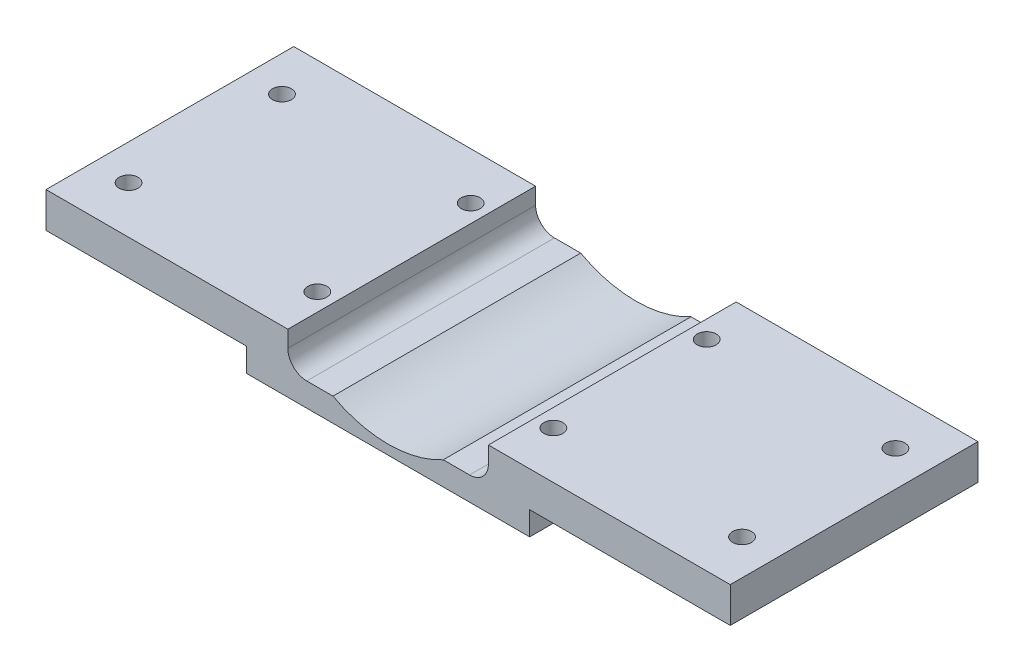
ISO-10303-21;
HEADER;
FILE_DESCRIPTION(('STEP AP214'),'2;1');
FILE_NAME('part.step','',(''),(''),'','','');
FILE_SCHEMA(('AUTOMOTIVE_DESIGN { 1 0 10303 214 1 1 1 1 }'));
ENDSEC;
DATA;
#1=APPLICATION_CONTEXT('core data for automotive mechanical design processes');
#2=APPLICATION_PROTOCOL_DEFINITION('international standard','automotive_design',2000,#1);
#3=PRODUCT_CONTEXT('',#1,'mechanical');
#4=PRODUCT('Part','Part','',(#3));
#5=PRODUCT_RELATED_PRODUCT_CATEGORY('part','',(#4));
#6=PRODUCT_DEFINITION_FORMATION('','',#4);
#7=PRODUCT_DEFINITION_CONTEXT('part definition',#1,'design');
#8=PRODUCT_DEFINITION('design','',#6,#7);
#9=PRODUCT_DEFINITION_SHAPE('','',#8);
#10=(LENGTH_UNIT() NAMED_UNIT(*) SI_UNIT(.MILLI.,.METRE.));
#11=(NAMED_UNIT(*) PLANE_ANGLE_UNIT() SI_UNIT($,.RADIAN.));
#12=(NAMED_UNIT(*) SI_UNIT($,.STERADIAN.) SOLID_ANGLE_UNIT());
#13=UNCERTAINTY_MEASURE_WITH_UNIT(LENGTH_MEASURE(1.E-05),#10,'distance_accuracy_value','');
#14=(GEOMETRIC_REPRESENTATION_CONTEXT(3) GLOBAL_UNCERTAINTY_ASSIGNED_CONTEXT((#13)) GLOBAL_UNIT_ASSIGNED_CONTEXT((#10,
#11,#12)) REPRESENTATION_CONTEXT('',''));
#15=CARTESIAN_POINT('',(0.,0.,0.));
#16=DIRECTION('',(0.,0.,1.));
#17=DIRECTION('',(1.,0.,0.));
#18=AXIS2_PLACEMENT_3D('',#15,#16,#17);
#19=CARTESIAN_POINT('',(0.,0.,0.));
#20=DIRECTION('',(0.,-1.,0.));
#21=DIRECTION('',(0.,0.,-1.));
#22=AXIS2_PLACEMENT_3D('',#19,#20,#21);
#23=PLANE('',#22);
#24=DIRECTION('',(-1.,0.,0.));
#25=VECTOR('',#24,1.);
#26=CARTESIAN_POINT('',(119.0625,0.,-66.675));
#27=LINE('',#26,#25);
#28=CARTESIAN_POINT('',(77.2354147488908,0.,-66.675));
#29=VERTEX_POINT('',#28);
#30=CARTESIAN_POINT('',(70.1675,0.,-66.675));
#31=VERTEX_POINT('',#30);
#32=EDGE_CURVE('E156',#29,#31,#27,.T.);
#33=ORIENTED_EDGE('',*,*,#32,.T.);
#34=DIRECTION('',(0.,0.,1.));
#35=VECTOR('',#34,1.);
#36=CARTESIAN_POINT('',(70.1675,0.,0.));
#37=LINE('',#36,#35);
#38=CARTESIAN_POINT('',(70.1675,0.,0.));
#39=VERTEX_POINT('',#38);
#40=EDGE_CURVE('E301',#31,#39,#37,.T.);
#41=ORIENTED_EDGE('',*,*,#40,.T.);
#42=DIRECTION('',(1.,0.,0.));
#43=VECTOR('',#42,1.);
#44=CARTESIAN_POINT('',(119.0625,0.,0.));
#45=LINE('',#44,#43);
#46=CARTESIAN_POINT('',(77.2354147488908,0.,0.));
#47=VERTEX_POINT('',#46);
#48=EDGE_CURVE('E223',#39,#47,#45,.T.);
#49=ORIENTED_EDGE('',*,*,#48,.T.);
#50=DIRECTION('',(0.,0.,-1.));
#51=VECTOR('',#50,1.);
#52=CARTESIAN_POINT('',(77.2354147488908,0.,0.));
#53=LINE('',#52,#51);
#54=EDGE_CURVE('E165',#47,#29,#53,.T.);
#55=ORIENTED_EDGE('',*,*,#54,.T.);
#56=EDGE_LOOP('',(#33,#41,#49,#55));
#57=FACE_BOUND('',#56,.T.);
#58=ADVANCED_FACE('F35',(#57),#23,.F.);
#59=CARTESIAN_POINT('',(0.,9.525,0.));
#60=DIRECTION('',(0.,-1.,0.));
#61=DIRECTION('',(0.,0.,-1.));
#62=AXIS2_PLACEMENT_3D('',#59,#60,#61);
#63=PLANE('',#62);
#64=CARTESIAN_POINT('',(60.325,9.525,-12.7));
#65=DIRECTION('',(0.,1.,0.));
#66=DIRECTION('',(0.,0.,1.));
#67=AXIS2_PLACEMENT_3D('',#64,#65,#66);
#68=CIRCLE('',#67,2.5527);
#69=CARTESIAN_POINT('',(60.325,9.525,-10.1473));
#70=VERTEX_POINT('',#69);
#71=EDGE_CURVE('E186',#70,#70,#68,.T.);
#72=ORIENTED_EDGE('',*,*,#71,.F.);
#73=EDGE_LOOP('',(#72));
#74=FACE_BOUND('',#73,.T.);
#75=CARTESIAN_POINT('',(60.325,9.525,-53.975));
#76=DIRECTION('',(0.,1.,0.));
#77=DIRECTION('',(0.,0.,1.));
#78=AXIS2_PLACEMENT_3D('',#75,#76,#77);
#79=CIRCLE('',#78,2.55270000000001);
#80=CARTESIAN_POINT('',(60.325,9.525,-51.4223));
#81=VERTEX_POINT('',#80);
#82=EDGE_CURVE('E192',#81,#81,#79,.T.);
#83=ORIENTED_EDGE('',*,*,#82,.F.);
#84=EDGE_LOOP('',(#83));
#85=FACE_BOUND('',#84,.T.);
#86=DIRECTION('',(1.,0.,0.));
#87=VECTOR('',#86,1.);
#88=CARTESIAN_POINT('',(0.,9.525,0.));
#89=LINE('',#88,#87);
#90=CARTESIAN_POINT('',(0.,9.525,0.));
#91=VERTEX_POINT('',#90);
#92=CARTESIAN_POINT('',(65.0875,9.525,0.));
#93=VERTEX_POINT('',#92);
#94=EDGE_CURVE('E269',#91,#93,#89,.T.);
#95=ORIENTED_EDGE('',*,*,#94,.T.);
#96=DIRECTION('',(0.,0.,1.));
#97=VECTOR('',#96,1.);
#98=CARTESIAN_POINT('',(65.0875,9.525,-66.675));
#99=LINE('',#98,#97);
#100=CARTESIAN_POINT('',(65.0875,9.525,-66.675));
#101=VERTEX_POINT('',#100);
#102=EDGE_CURVE('E228',#101,#93,#99,.T.);
#103=ORIENTED_EDGE('',*,*,#102,.F.);
#104=DIRECTION('',(-1.,0.,0.));
#105=VECTOR('',#104,1.);
#106=CARTESIAN_POINT('',(0.,9.525,-66.675));
#107=LINE('',#106,#105);
#108=CARTESIAN_POINT('',(0.,9.525,-66.675));
#109=VERTEX_POINT('',#108);
#110=EDGE_CURVE('E274',#101,#109,#107,.T.);
#111=ORIENTED_EDGE('',*,*,#110,.T.);
#112=DIRECTION('',(0.,0.,1.));
#113=VECTOR('',#112,1.);
#114=CARTESIAN_POINT('',(0.,9.525,0.));
#115=LINE('',#114,#113);
#116=EDGE_CURVE('E264',#109,#91,#115,.T.);
#117=ORIENTED_EDGE('',*,*,#116,.T.);
#118=EDGE_LOOP('',(#95,#103,#111,#117));
#119=FACE_BOUND('',#118,.T.);
#120=CARTESIAN_POINT('',(9.525,9.525,-12.7));
#121=DIRECTION('',(0.,1.,0.));
#122=DIRECTION('',(0.,0.,1.));
#123=AXIS2_PLACEMENT_3D('',#120,#121,#122);
#124=CIRCLE('',#123,2.5527);
#125=CARTESIAN_POINT('',(9.525,9.525,-10.1473));
#126=VERTEX_POINT('',#125);
#127=EDGE_CURVE('E180',#126,#126,#124,.T.);
#128=ORIENTED_EDGE('',*,*,#127,.F.);
#129=EDGE_LOOP('',(#128));
#130=FACE_BOUND('',#129,.T.);
#131=CARTESIAN_POINT('',(9.52500000000001,9.525,-53.975));
#132=DIRECTION('',(0.,1.,0.));
#133=DIRECTION('',(0.,0.,1.));
#134=AXIS2_PLACEMENT_3D('',#131,#132,#133);
#135=CIRCLE('',#134,2.5527);
#136=CARTESIAN_POINT('',(9.52500000000001,9.525,-51.4223));
#137=VERTEX_POINT('',#136);
#138=EDGE_CURVE('E172',#137,#137,#135,.T.);
#139=ORIENTED_EDGE('',*,*,#138,.F.);
#140=EDGE_LOOP('',(#139));
#141=FACE_BOUND('',#140,.T.);
#142=ADVANCED_FACE('F327',(#74,#85,#119,#130,#141),#63,.F.);
#143=CARTESIAN_POINT('',(123.825,9.525,-53.975));
#144=DIRECTION('',(0.,1.,0.));
#145=DIRECTION('',(0.,0.,1.));
#146=AXIS2_PLACEMENT_3D('',#143,#144,#145);
#147=CIRCLE('',#146,2.55270000000001);
#148=CARTESIAN_POINT('',(123.825,9.525,-51.4223));
#149=VERTEX_POINT('',#148);
#150=EDGE_CURVE('E198',#149,#149,#147,.T.);
#151=ORIENTED_EDGE('',*,*,#150,.F.);
#152=EDGE_LOOP('',(#151));
#153=FACE_BOUND('',#152,.T.);
#154=CARTESIAN_POINT('',(123.849810746291,9.525,-12.7));
#155=DIRECTION('',(0.,1.,0.));
#156=DIRECTION('',(0.,0.,1.));
#157=AXIS2_PLACEMENT_3D('',#154,#155,#156);
#158=CIRCLE('',#157,2.55270000000001);
#159=CARTESIAN_POINT('',(123.849810746291,9.525,-10.1473));
#160=VERTEX_POINT('',#159);
#161=EDGE_CURVE('E204',#160,#160,#158,.T.);
#162=ORIENTED_EDGE('',*,*,#161,.F.);
#163=EDGE_LOOP('',(#162));
#164=FACE_BOUND('',#163,.T.);
#165=CARTESIAN_POINT('',(174.625,9.525,-12.7));
#166=DIRECTION('',(0.,1.,0.));
#167=DIRECTION('',(0.,0.,1.));
#168=AXIS2_PLACEMENT_3D('',#165,#166,#167);
#169=CIRCLE('',#168,2.55269999999999);
#170=CARTESIAN_POINT('',(174.625,9.525,-10.1473));
#171=VERTEX_POINT('',#170);
#172=EDGE_CURVE('E210',#171,#171,#169,.T.);
#173=ORIENTED_EDGE('',*,*,#172,.F.);
#174=EDGE_LOOP('',(#173));
#175=FACE_BOUND('',#174,.T.);
#176=CARTESIAN_POINT('',(174.625,9.525,-53.975));
#177=DIRECTION('',(0.,1.,0.));
#178=DIRECTION('',(0.,0.,1.));
#179=AXIS2_PLACEMENT_3D('',#176,#177,#178);
#180=CIRCLE('',#179,2.55269999999999);
#181=CARTESIAN_POINT('',(174.625,9.525,-51.4223));
#182=VERTEX_POINT('',#181);
#183=EDGE_CURVE('E216',#182,#182,#180,.T.);
#184=ORIENTED_EDGE('',*,*,#183,.F.);
#185=EDGE_LOOP('',(#184));
#186=FACE_BOUND('',#185,.T.);
#187=CARTESIAN_POINT('',(184.15,9.525,-66.675));
#188=VERTEX_POINT('',#187);
#189=CARTESIAN_POINT('',(119.0625,9.525,-66.675));
#190=VERTEX_POINT('',#189);
#191=EDGE_CURVE('E275',#188,#190,#107,.T.);
#192=ORIENTED_EDGE('',*,*,#191,.T.);
#193=DIRECTION('',(0.,0.,-1.));
#194=VECTOR('',#193,1.);
#195=CARTESIAN_POINT('',(119.0625,9.525,-66.675));
#196=LINE('',#195,#194);
#197=CARTESIAN_POINT('',(119.0625,9.525,0.));
#198=VERTEX_POINT('',#197);
#199=EDGE_CURVE('E221',#198,#190,#196,.T.);
#200=ORIENTED_EDGE('',*,*,#199,.F.);
#201=CARTESIAN_POINT('',(184.15,9.525,0.));
#202=VERTEX_POINT('',#201);
#203=EDGE_CURVE('E267',#198,#202,#89,.T.);
#204=ORIENTED_EDGE('',*,*,#203,.T.);
#205=DIRECTION('',(0.,0.,-1.));
#206=VECTOR('',#205,1.);
#207=CARTESIAN_POINT('',(184.15,9.525,0.));
#208=LINE('',#207,#206);
#209=EDGE_CURVE('E272',#202,#188,#208,.T.);
#210=ORIENTED_EDGE('',*,*,#209,.T.);
#211=EDGE_LOOP('',(#192,#200,#204,#210));
#212=FACE_BOUND('',#211,.T.);
#213=ADVANCED_FACE('F366',(#153,#164,#175,#186,#212),#63,.F.);
#214=CARTESIAN_POINT('',(0.,0.,0.));
#215=DIRECTION('',(0.,-1.,0.));
#216=DIRECTION('',(0.,0.,-1.));
#217=AXIS2_PLACEMENT_3D('',#214,#215,#216);
#218=PLANE('',#217);
#219=CARTESIAN_POINT('',(9.52500000000001,0.,-53.975));
#220=DIRECTION('',(0.,-1.,0.));
#221=DIRECTION('',(0.,0.,-1.));
#222=AXIS2_PLACEMENT_3D('',#219,#220,#221);
#223=CIRCLE('',#222,2.5527);
#224=CARTESIAN_POINT('',(9.52500000000001,0.,-56.5277));
#225=VERTEX_POINT('',#224);
#226=EDGE_CURVE('E177',#225,#225,#223,.T.);
#227=ORIENTED_EDGE('',*,*,#226,.F.);
#228=EDGE_LOOP('',(#227));
#229=FACE_BOUND('',#228,.T.);
#230=CARTESIAN_POINT('',(9.525,0.,-12.7));
#231=DIRECTION('',(0.,-1.,0.));
#232=DIRECTION('',(0.,0.,-1.));
#233=AXIS2_PLACEMENT_3D('',#230,#231,#232);
#234=CIRCLE('',#233,2.5527);
#235=CARTESIAN_POINT('',(9.525,0.,-15.2527));
#236=VERTEX_POINT('',#235);
#237=EDGE_CURVE('E183',#236,#236,#234,.T.);
#238=ORIENTED_EDGE('',*,*,#237,.F.);
#239=EDGE_LOOP('',(#238));
#240=FACE_BOUND('',#239,.T.);
#241=DIRECTION('',(-1.,0.,0.));
#242=VECTOR('',#241,1.);
#243=CARTESIAN_POINT('',(0.,0.,-66.675));
#244=LINE('',#243,#242);
#245=CARTESIAN_POINT('',(53.975,0.,-66.675));
#246=VERTEX_POINT('',#245);
#247=CARTESIAN_POINT('',(0.,0.,-66.675));
#248=VERTEX_POINT('',#247);
#249=EDGE_CURVE('E287',#246,#248,#244,.T.);
#250=ORIENTED_EDGE('',*,*,#249,.F.);
#251=DIRECTION('',(0.,0.,1.));
#252=VECTOR('',#251,1.);
#253=CARTESIAN_POINT('',(53.975,0.,-143.139125575331));
#254=LINE('',#253,#252);
#255=CARTESIAN_POINT('',(53.975,0.,0.));
#256=VERTEX_POINT('',#255);
#257=EDGE_CURVE('E242',#246,#256,#254,.T.);
#258=ORIENTED_EDGE('',*,*,#257,.T.);
#259=DIRECTION('',(1.,0.,0.));
#260=VECTOR('',#259,1.);
#261=CARTESIAN_POINT('',(0.,0.,0.));
#262=LINE('',#261,#260);
#263=CARTESIAN_POINT('',(0.,0.,0.));
#264=VERTEX_POINT('',#263);
#265=EDGE_CURVE('E282',#264,#256,#262,.T.);
#266=ORIENTED_EDGE('',*,*,#265,.F.);
#267=DIRECTION('',(0.,0.,1.));
#268=VECTOR('',#267,1.);
#269=CARTESIAN_POINT('',(0.,0.,0.));
#270=LINE('',#269,#268);
#271=EDGE_CURVE('E263',#248,#264,#270,.T.);
#272=ORIENTED_EDGE('',*,*,#271,.F.);
#273=EDGE_LOOP('',(#250,#258,#266,#272));
#274=FACE_BOUND('',#273,.T.);
#275=ADVANCED_FACE('F337',(#229,#240,#274),#218,.T.);
#276=CARTESIAN_POINT('',(0.,9.525,0.));
#277=DIRECTION('',(1.,0.,0.));
#278=DIRECTION('',(0.,0.,-1.));
#279=AXIS2_PLACEMENT_3D('',#276,#277,#278);
#280=PLANE('',#279);
#281=ORIENTED_EDGE('',*,*,#271,.T.);
#282=DIRECTION('',(0.,-1.,0.));
#283=VECTOR('',#282,1.);
#284=CARTESIAN_POINT('',(0.,9.525,0.));
#285=LINE('',#284,#283);
#286=EDGE_CURVE('E166',#91,#264,#285,.T.);
#287=ORIENTED_EDGE('',*,*,#286,.F.);
#288=ORIENTED_EDGE('',*,*,#116,.F.);
#289=DIRECTION('',(0.,-1.,0.));
#290=VECTOR('',#289,1.);
#291=CARTESIAN_POINT('',(0.,9.525,-66.675));
#292=LINE('',#291,#290);
#293=EDGE_CURVE('E278',#109,#248,#292,.T.);
#294=ORIENTED_EDGE('',*,*,#293,.T.);
#295=EDGE_LOOP('',(#281,#287,#288,#294));
#296=FACE_BOUND('',#295,.T.);
#297=ADVANCED_FACE('F334',(#296),#280,.F.);
#298=CARTESIAN_POINT('',(0.,9.525,0.));
#299=DIRECTION('',(0.,0.,-1.));
#300=DIRECTION('',(-1.,0.,0.));
#301=AXIS2_PLACEMENT_3D('',#298,#299,#300);
#302=PLANE('',#301);
#303=CARTESIAN_POINT('',(106.914585251109,0.,0.));
#304=VERTEX_POINT('',#303);
#305=CARTESIAN_POINT('',(113.9825,0.,0.));
#306=VERTEX_POINT('',#305);
#307=EDGE_CURVE('E155',#304,#306,#45,.T.);
#308=ORIENTED_EDGE('',*,*,#307,.F.);
#309=CARTESIAN_POINT('',(92.0749999999998,27.2393713169503,0.));
#310=DIRECTION('',(0.,0.,-1.));
#311=DIRECTION('',(-1.,0.,0.));
#312=AXIS2_PLACEMENT_3D('',#309,#310,#311);
#313=CIRCLE('',#312,31.0192946432962);
#314=EDGE_CURVE('E164',#304,#47,#313,.T.);
#315=ORIENTED_EDGE('',*,*,#314,.T.);
#316=ORIENTED_EDGE('',*,*,#48,.F.);
#317=CARTESIAN_POINT('',(70.1675,5.08,0.));
#318=DIRECTION('',(0.,0.,-1.));
#319=DIRECTION('',(-1.,0.,0.));
#320=AXIS2_PLACEMENT_3D('',#317,#318,#319);
#321=CIRCLE('',#320,5.08);
#322=CARTESIAN_POINT('',(65.0875,5.08,0.));
#323=VERTEX_POINT('',#322);
#324=EDGE_CURVE('E306',#39,#323,#321,.T.);
#325=ORIENTED_EDGE('',*,*,#324,.T.);
#326=DIRECTION('',(0.,1.,0.));
#327=VECTOR('',#326,1.);
#328=CARTESIAN_POINT('',(65.0875,0.,0.));
#329=LINE('',#328,#327);
#330=EDGE_CURVE('E234',#323,#93,#329,.T.);
#331=ORIENTED_EDGE('',*,*,#330,.T.);
#332=ORIENTED_EDGE('',*,*,#94,.F.);
#333=ORIENTED_EDGE('',*,*,#286,.T.);
#334=ORIENTED_EDGE('',*,*,#265,.T.);
#335=DIRECTION('',(0.,-1.,0.));
#336=VECTOR('',#335,1.);
#337=CARTESIAN_POINT('',(53.975,0.,0.));
#338=LINE('',#337,#336);
#339=CARTESIAN_POINT('',(53.975,-6.35,0.));
#340=VERTEX_POINT('',#339);
#341=EDGE_CURVE('E233',#256,#340,#338,.T.);
#342=ORIENTED_EDGE('',*,*,#341,.T.);
#343=DIRECTION('',(1.,0.,0.));
#344=VECTOR('',#343,1.);
#345=CARTESIAN_POINT('',(53.975,-6.35,0.));
#346=LINE('',#345,#344);
#347=CARTESIAN_POINT('',(130.175,-6.34999999999999,0.));
#348=VERTEX_POINT('',#347);
#349=EDGE_CURVE('E248',#340,#348,#346,.T.);
#350=ORIENTED_EDGE('',*,*,#349,.T.);
#351=DIRECTION('',(0.,1.,0.));
#352=VECTOR('',#351,1.);
#353=CARTESIAN_POINT('',(130.175,0.,0.));
#354=LINE('',#353,#352);
#355=CARTESIAN_POINT('',(130.175,0.,0.));
#356=VERTEX_POINT('',#355);
#357=EDGE_CURVE('E251',#348,#356,#354,.T.);
#358=ORIENTED_EDGE('',*,*,#357,.T.);
#359=CARTESIAN_POINT('',(184.15,0.,0.));
#360=VERTEX_POINT('',#359);
#361=EDGE_CURVE('E281',#356,#360,#262,.T.);
#362=ORIENTED_EDGE('',*,*,#361,.T.);
#363=DIRECTION('',(0.,-1.,0.));
#364=VECTOR('',#363,1.);
#365=CARTESIAN_POINT('',(184.15,9.525,0.));
#366=LINE('',#365,#364);
#367=EDGE_CURVE('E295',#202,#360,#366,.T.);
#368=ORIENTED_EDGE('',*,*,#367,.F.);
#369=ORIENTED_EDGE('',*,*,#203,.F.);
#370=DIRECTION('',(0.,1.,0.));
#371=VECTOR('',#370,1.);
#372=CARTESIAN_POINT('',(119.0625,0.,0.));
#373=LINE('',#372,#371);
#374=CARTESIAN_POINT('',(119.0625,5.08,0.));
#375=VERTEX_POINT('',#374);
#376=EDGE_CURVE('E231',#375,#198,#373,.T.);
#377=ORIENTED_EDGE('',*,*,#376,.F.);
#378=CARTESIAN_POINT('',(113.9825,5.08,0.));
#379=DIRECTION('',(0.,0.,-1.));
#380=DIRECTION('',(-1.,0.,0.));
#381=AXIS2_PLACEMENT_3D('',#378,#379,#380);
#382=CIRCLE('',#381,5.08);
#383=EDGE_CURVE('E11',#375,#306,#382,.T.);
#384=ORIENTED_EDGE('',*,*,#383,.T.);
#385=EDGE_LOOP('',(#308,#315,#316,#325,#331,#332,#333,#334,#342,#350,#358,#362,#368,#369,#377,#384));
#386=FACE_BOUND('',#385,.T.);
#387=ADVANCED_FACE('F322',(#386),#302,.F.);
#388=CARTESIAN_POINT('',(184.15,9.525,0.));
#389=DIRECTION('',(-1.,0.,0.));
#390=DIRECTION('',(0.,0.,1.));
#391=AXIS2_PLACEMENT_3D('',#388,#389,#390);
#392=PLANE('',#391);
#393=DIRECTION('',(0.,0.,-1.));
#394=VECTOR('',#393,1.);
#395=CARTESIAN_POINT('',(184.15,0.,0.));
#396=LINE('',#395,#394);
#397=CARTESIAN_POINT('',(184.15,0.,-66.675));
#398=VERTEX_POINT('',#397);
#399=EDGE_CURVE('E285',#360,#398,#396,.T.);
#400=ORIENTED_EDGE('',*,*,#399,.T.);
#401=DIRECTION('',(0.,-1.,0.));
#402=VECTOR('',#401,1.);
#403=CARTESIAN_POINT('',(184.15,9.525,-66.675));
#404=LINE('',#403,#402);
#405=EDGE_CURVE('E292',#188,#398,#404,.T.);
#406=ORIENTED_EDGE('',*,*,#405,.F.);
#407=ORIENTED_EDGE('',*,*,#209,.F.);
#408=ORIENTED_EDGE('',*,*,#367,.T.);
#409=EDGE_LOOP('',(#400,#406,#407,#408));
#410=FACE_BOUND('',#409,.T.);
#411=ADVANCED_FACE('F360',(#410),#392,.F.);
#412=CARTESIAN_POINT('',(0.,9.525,-66.675));
#413=DIRECTION('',(0.,0.,1.));
#414=DIRECTION('',(1.,0.,0.));
#415=AXIS2_PLACEMENT_3D('',#412,#413,#414);
#416=PLANE('',#415);
#417=ORIENTED_EDGE('',*,*,#32,.F.);
#418=CARTESIAN_POINT('',(92.0749999999998,27.2393713169503,-66.675));
#419=DIRECTION('',(0.,0.,-1.));
#420=DIRECTION('',(-1.,0.,0.));
#421=AXIS2_PLACEMENT_3D('',#418,#419,#420);
#422=CIRCLE('',#421,31.0192946432962);
#423=CARTESIAN_POINT('',(106.914585251109,0.,-66.675));
#424=VERTEX_POINT('',#423);
#425=EDGE_CURVE('E161',#424,#29,#422,.T.);
#426=ORIENTED_EDGE('',*,*,#425,.F.);
#427=CARTESIAN_POINT('',(113.9825,0.,-66.675));
#428=VERTEX_POINT('',#427);
#429=EDGE_CURVE('E146',#428,#424,#27,.T.);
#430=ORIENTED_EDGE('',*,*,#429,.F.);
#431=CARTESIAN_POINT('',(113.9825,5.08,-66.675));
#432=DIRECTION('',(0.,0.,1.));
#433=DIRECTION('',(1.,0.,0.));
#434=AXIS2_PLACEMENT_3D('',#431,#432,#433);
#435=CIRCLE('',#434,5.08);
#436=CARTESIAN_POINT('',(119.0625,5.08,-66.675));
#437=VERTEX_POINT('',#436);
#438=EDGE_CURVE('E43',#428,#437,#435,.T.);
#439=ORIENTED_EDGE('',*,*,#438,.T.);
#440=DIRECTION('',(0.,1.,0.));
#441=VECTOR('',#440,1.);
#442=CARTESIAN_POINT('',(119.0625,0.,-66.675));
#443=LINE('',#442,#441);
#444=EDGE_CURVE('E225',#437,#190,#443,.T.);
#445=ORIENTED_EDGE('',*,*,#444,.T.);
#446=ORIENTED_EDGE('',*,*,#191,.F.);
#447=ORIENTED_EDGE('',*,*,#405,.T.);
#448=CARTESIAN_POINT('',(130.175,0.,-66.675));
#449=VERTEX_POINT('',#448);
#450=EDGE_CURVE('E268',#398,#449,#244,.T.);
#451=ORIENTED_EDGE('',*,*,#450,.T.);
#452=DIRECTION('',(0.,-1.,0.));
#453=VECTOR('',#452,1.);
#454=CARTESIAN_POINT('',(130.175,0.,-66.675));
#455=LINE('',#454,#453);
#456=CARTESIAN_POINT('',(130.175,-6.34999999999999,-66.675));
#457=VERTEX_POINT('',#456);
#458=EDGE_CURVE('E239',#449,#457,#455,.T.);
#459=ORIENTED_EDGE('',*,*,#458,.T.);
#460=DIRECTION('',(-1.,0.,0.));
#461=VECTOR('',#460,1.);
#462=CARTESIAN_POINT('',(53.975,-6.35,-66.675));
#463=LINE('',#462,#461);
#464=CARTESIAN_POINT('',(53.975,-6.35,-66.675));
#465=VERTEX_POINT('',#464);
#466=EDGE_CURVE('E245',#457,#465,#463,.T.);
#467=ORIENTED_EDGE('',*,*,#466,.T.);
#468=DIRECTION('',(0.,1.,0.));
#469=VECTOR('',#468,1.);
#470=CARTESIAN_POINT('',(53.975,0.,-66.675));
#471=LINE('',#470,#469);
#472=EDGE_CURVE('E241',#465,#246,#471,.T.);
#473=ORIENTED_EDGE('',*,*,#472,.T.);
#474=ORIENTED_EDGE('',*,*,#249,.T.);
#475=ORIENTED_EDGE('',*,*,#293,.F.);
#476=ORIENTED_EDGE('',*,*,#110,.F.);
#477=DIRECTION('',(0.,1.,0.));
#478=VECTOR('',#477,1.);
#479=CARTESIAN_POINT('',(65.0875,0.,-66.675));
#480=LINE('',#479,#478);
#481=CARTESIAN_POINT('',(65.0875,5.08,-66.675));
#482=VERTEX_POINT('',#481);
#483=EDGE_CURVE('E236',#482,#101,#480,.T.);
#484=ORIENTED_EDGE('',*,*,#483,.F.);
#485=CARTESIAN_POINT('',(70.1675,5.08,-66.675));
#486=DIRECTION('',(0.,0.,1.));
#487=DIRECTION('',(1.,0.,0.));
#488=AXIS2_PLACEMENT_3D('',#485,#486,#487);
#489=CIRCLE('',#488,5.08);
#490=EDGE_CURVE('E308',#482,#31,#489,.T.);
#491=ORIENTED_EDGE('',*,*,#490,.T.);
#492=EDGE_LOOP('',(#417,#426,#430,#439,#445,#446,#447,#451,#459,#467,#473,#474,#475,#476,#484,#491));
#493=FACE_BOUND('',#492,.T.);
#494=ADVANCED_FACE('F169',(#493),#416,.F.);
#495=CARTESIAN_POINT('',(174.625,0.,-12.7));
#496=DIRECTION('',(0.,-1.,0.));
#497=DIRECTION('',(0.,0.,-1.));
#498=AXIS2_PLACEMENT_3D('',#495,#496,#497);
#499=CIRCLE('',#498,2.55269999999999);
#500=CARTESIAN_POINT('',(174.625,0.,-15.2527));
#501=VERTEX_POINT('',#500);
#502=EDGE_CURVE('E213',#501,#501,#499,.T.);
#503=ORIENTED_EDGE('',*,*,#502,.F.);
#504=EDGE_LOOP('',(#503));
#505=FACE_BOUND('',#504,.T.);
#506=CARTESIAN_POINT('',(174.625,0.,-53.975));
#507=DIRECTION('',(0.,-1.,0.));
#508=DIRECTION('',(0.,0.,-1.));
#509=AXIS2_PLACEMENT_3D('',#506,#507,#508);
#510=CIRCLE('',#509,2.55269999999999);
#511=CARTESIAN_POINT('',(174.625,0.,-56.5277));
#512=VERTEX_POINT('',#511);
#513=EDGE_CURVE('E219',#512,#512,#510,.T.);
#514=ORIENTED_EDGE('',*,*,#513,.F.);
#515=EDGE_LOOP('',(#514));
#516=FACE_BOUND('',#515,.T.);
#517=DIRECTION('',(0.,0.,1.));
#518=VECTOR('',#517,1.);
#519=CARTESIAN_POINT('',(130.175,0.,-143.139125575331));
#520=LINE('',#519,#518);
#521=EDGE_CURVE('E256',#449,#356,#520,.T.);
#522=ORIENTED_EDGE('',*,*,#521,.F.);
#523=ORIENTED_EDGE('',*,*,#450,.F.);
#524=ORIENTED_EDGE('',*,*,#399,.F.);
#525=ORIENTED_EDGE('',*,*,#361,.F.);
#526=EDGE_LOOP('',(#522,#523,#524,#525));
#527=FACE_BOUND('',#526,.T.);
#528=ADVANCED_FACE('F354',(#505,#516,#527),#218,.T.);
#529=CARTESIAN_POINT('',(53.975,0.,-143.139125575331));
#530=DIRECTION('',(-1.,0.,0.));
#531=DIRECTION('',(0.,0.,1.));
#532=AXIS2_PLACEMENT_3D('',#529,#530,#531);
#533=PLANE('',#532);
#534=ORIENTED_EDGE('',*,*,#472,.F.);
#535=DIRECTION('',(0.,0.,1.));
#536=VECTOR('',#535,1.);
#537=CARTESIAN_POINT('',(53.975,-6.35,-143.139125575331));
#538=LINE('',#537,#536);
#539=EDGE_CURVE('E254',#465,#340,#538,.T.);
#540=ORIENTED_EDGE('',*,*,#539,.T.);
#541=ORIENTED_EDGE('',*,*,#341,.F.);
#542=ORIENTED_EDGE('',*,*,#257,.F.);
#543=EDGE_LOOP('',(#534,#540,#541,#542));
#544=FACE_BOUND('',#543,.T.);
#545=ADVANCED_FACE('F341',(#544),#533,.T.);
#546=CARTESIAN_POINT('',(130.175,0.,-143.139125575331));
#547=DIRECTION('',(1.,0.,0.));
#548=DIRECTION('',(0.,1.,0.));
#549=AXIS2_PLACEMENT_3D('',#546,#547,#548);
#550=PLANE('',#549);
#551=ORIENTED_EDGE('',*,*,#458,.F.);
#552=ORIENTED_EDGE('',*,*,#521,.T.);
#553=ORIENTED_EDGE('',*,*,#357,.F.);
#554=DIRECTION('',(0.,0.,1.));
#555=VECTOR('',#554,1.);
#556=CARTESIAN_POINT('',(130.175,-6.34999999999999,-143.139125575331));
#557=LINE('',#556,#555);
#558=EDGE_CURVE('E259',#457,#348,#557,.T.);
#559=ORIENTED_EDGE('',*,*,#558,.F.);
#560=EDGE_LOOP('',(#551,#552,#553,#559));
#561=FACE_BOUND('',#560,.T.);
#562=ADVANCED_FACE('F351',(#561),#550,.T.);
#563=CARTESIAN_POINT('',(53.975,-6.35,-143.139125575331));
#564=DIRECTION('',(0.,-1.,0.));
#565=DIRECTION('',(1.,0.,0.));
#566=AXIS2_PLACEMENT_3D('',#563,#564,#565);
#567=PLANE('',#566);
#568=CARTESIAN_POINT('',(60.325,-6.35,-12.7));
#569=DIRECTION('',(0.,-1.,0.));
#570=DIRECTION('',(1.,0.,0.));
#571=AXIS2_PLACEMENT_3D('',#568,#569,#570);
#572=CIRCLE('',#571,2.5527);
#573=CARTESIAN_POINT('',(62.8777,-6.35,-12.7));
#574=VERTEX_POINT('',#573);
#575=EDGE_CURVE('E189',#574,#574,#572,.T.);
#576=ORIENTED_EDGE('',*,*,#575,.F.);
#577=EDGE_LOOP('',(#576));
#578=FACE_BOUND('',#577,.T.);
#579=CARTESIAN_POINT('',(60.325,-6.35,-53.975));
#580=DIRECTION('',(0.,-1.,0.));
#581=DIRECTION('',(1.,0.,0.));
#582=AXIS2_PLACEMENT_3D('',#579,#580,#581);
#583=CIRCLE('',#582,2.5527);
#584=CARTESIAN_POINT('',(62.8777,-6.35,-53.975));
#585=VERTEX_POINT('',#584);
#586=EDGE_CURVE('E195',#585,#585,#583,.T.);
#587=ORIENTED_EDGE('',*,*,#586,.F.);
#588=EDGE_LOOP('',(#587));
#589=FACE_BOUND('',#588,.T.);
#590=CARTESIAN_POINT('',(123.825,-6.34999999999999,-53.975));
#591=DIRECTION('',(0.,-1.,0.));
#592=DIRECTION('',(1.,0.,0.));
#593=AXIS2_PLACEMENT_3D('',#590,#591,#592);
#594=CIRCLE('',#593,2.55270000000001);
#595=CARTESIAN_POINT('',(126.3777,-6.34999999999999,-53.975));
#596=VERTEX_POINT('',#595);
#597=EDGE_CURVE('E201',#596,#596,#594,.T.);
#598=ORIENTED_EDGE('',*,*,#597,.F.);
#599=EDGE_LOOP('',(#598));
#600=FACE_BOUND('',#599,.T.);
#601=CARTESIAN_POINT('',(123.849810746291,-6.34999999999999,-12.7));
#602=DIRECTION('',(0.,-1.,0.));
#603=DIRECTION('',(1.,0.,0.));
#604=AXIS2_PLACEMENT_3D('',#601,#602,#603);
#605=CIRCLE('',#604,2.55270000000001);
#606=CARTESIAN_POINT('',(126.402510746291,-6.34999999999999,-12.7));
#607=VERTEX_POINT('',#606);
#608=EDGE_CURVE('E207',#607,#607,#605,.T.);
#609=ORIENTED_EDGE('',*,*,#608,.F.);
#610=EDGE_LOOP('',(#609));
#611=FACE_BOUND('',#610,.T.);
#612=ORIENTED_EDGE('',*,*,#466,.F.);
#613=ORIENTED_EDGE('',*,*,#558,.T.);
#614=ORIENTED_EDGE('',*,*,#349,.F.);
#615=ORIENTED_EDGE('',*,*,#539,.F.);
#616=EDGE_LOOP('',(#612,#613,#614,#615));
#617=FACE_BOUND('',#616,.T.);
#618=ADVANCED_FACE('F347',(#578,#589,#600,#611,#617),#567,.T.);
#619=CARTESIAN_POINT('',(119.0625,0.,-66.675));
#620=DIRECTION('',(1.,0.,0.));
#621=DIRECTION('',(0.,0.,-1.));
#622=AXIS2_PLACEMENT_3D('',#619,#620,#621);
#623=PLANE('',#622);
#624=ORIENTED_EDGE('',*,*,#444,.F.);
#625=DIRECTION('',(0.,0.,-1.));
#626=VECTOR('',#625,1.);
#627=CARTESIAN_POINT('',(119.0625,5.08,0.));
#628=LINE('',#627,#626);
#629=EDGE_CURVE('E50',#437,#375,#628,.F.);
#630=ORIENTED_EDGE('',*,*,#629,.T.);
#631=ORIENTED_EDGE('',*,*,#376,.T.);
#632=ORIENTED_EDGE('',*,*,#199,.T.);
#633=EDGE_LOOP('',(#624,#630,#631,#632));
#634=FACE_BOUND('',#633,.T.);
#635=ADVANCED_FACE('F367',(#634),#623,.F.);
#636=CARTESIAN_POINT('',(65.0875,0.,-66.675));
#637=DIRECTION('',(-1.,0.,0.));
#638=DIRECTION('',(0.,0.,1.));
#639=AXIS2_PLACEMENT_3D('',#636,#637,#638);
#640=PLANE('',#639);
#641=ORIENTED_EDGE('',*,*,#330,.F.);
#642=DIRECTION('',(0.,0.,1.));
#643=VECTOR('',#642,1.);
#644=CARTESIAN_POINT('',(65.0875,5.08,-66.675));
#645=LINE('',#644,#643);
#646=EDGE_CURVE('E304',#323,#482,#645,.F.);
#647=ORIENTED_EDGE('',*,*,#646,.T.);
#648=ORIENTED_EDGE('',*,*,#483,.T.);
#649=ORIENTED_EDGE('',*,*,#102,.T.);
#650=EDGE_LOOP('',(#641,#647,#648,#649));
#651=FACE_BOUND('',#650,.T.);
#652=ADVANCED_FACE('F324',(#651),#640,.F.);
#653=ORIENTED_EDGE('',*,*,#307,.T.);
#654=DIRECTION('',(0.,0.,-1.));
#655=VECTOR('',#654,1.);
#656=CARTESIAN_POINT('',(113.9825,0.,-66.675));
#657=LINE('',#656,#655);
#658=EDGE_CURVE('E153',#306,#428,#657,.T.);
#659=ORIENTED_EDGE('',*,*,#658,.T.);
#660=ORIENTED_EDGE('',*,*,#429,.T.);
#661=DIRECTION('',(0.,0.,-1.));
#662=VECTOR('',#661,1.);
#663=CARTESIAN_POINT('',(106.914585251109,0.,0.));
#664=LINE('',#663,#662);
#665=EDGE_CURVE('E150',#424,#304,#664,.F.);
#666=ORIENTED_EDGE('',*,*,#665,.T.);
#667=EDGE_LOOP('',(#653,#659,#660,#666));
#668=FACE_BOUND('',#667,.T.);
#669=ADVANCED_FACE('F149',(#668),#23,.F.);
#670=CARTESIAN_POINT('',(174.625,9.525,-53.975));
#671=DIRECTION('',(0.,1.,0.));
#672=DIRECTION('',(0.,0.,1.));
#673=AXIS2_PLACEMENT_3D('',#670,#671,#672);
#674=CYLINDRICAL_SURFACE('',#673,2.55269999999999);
#675=ORIENTED_EDGE('',*,*,#183,.T.);
#676=EDGE_LOOP('',(#675));
#677=FACE_BOUND('',#676,.T.);
#678=ORIENTED_EDGE('',*,*,#513,.T.);
#679=EDGE_LOOP('',(#678));
#680=FACE_BOUND('',#679,.T.);
#681=ADVANCED_FACE('F383',(#677,#680),#674,.F.);
#682=CARTESIAN_POINT('',(174.625,9.525,-12.7));
#683=DIRECTION('',(0.,1.,0.));
#684=DIRECTION('',(0.,0.,1.));
#685=AXIS2_PLACEMENT_3D('',#682,#683,#684);
#686=CYLINDRICAL_SURFACE('',#685,2.55269999999999);
#687=ORIENTED_EDGE('',*,*,#172,.T.);
#688=EDGE_LOOP('',(#687));
#689=FACE_BOUND('',#688,.T.);
#690=ORIENTED_EDGE('',*,*,#502,.T.);
#691=EDGE_LOOP('',(#690));
#692=FACE_BOUND('',#691,.T.);
#693=ADVANCED_FACE('F388',(#689,#692),#686,.F.);
#694=CARTESIAN_POINT('',(123.849810746291,9.525,-12.7));
#695=DIRECTION('',(0.,1.,0.));
#696=DIRECTION('',(0.,0.,1.));
#697=AXIS2_PLACEMENT_3D('',#694,#695,#696);
#698=CYLINDRICAL_SURFACE('',#697,2.55270000000001);
#699=ORIENTED_EDGE('',*,*,#161,.T.);
#700=EDGE_LOOP('',(#699));
#701=FACE_BOUND('',#700,.T.);
#702=ORIENTED_EDGE('',*,*,#608,.T.);
#703=EDGE_LOOP('',(#702));
#704=FACE_BOUND('',#703,.T.);
#705=ADVANCED_FACE('F447',(#701,#704),#698,.F.);
#706=CARTESIAN_POINT('',(123.825,9.525,-53.975));
#707=DIRECTION('',(0.,1.,0.));
#708=DIRECTION('',(0.,0.,1.));
#709=AXIS2_PLACEMENT_3D('',#706,#707,#708);
#710=CYLINDRICAL_SURFACE('',#709,2.55270000000001);
#711=ORIENTED_EDGE('',*,*,#150,.T.);
#712=EDGE_LOOP('',(#711));
#713=FACE_BOUND('',#712,.T.);
#714=ORIENTED_EDGE('',*,*,#597,.T.);
#715=EDGE_LOOP('',(#714));
#716=FACE_BOUND('',#715,.T.);
#717=ADVANCED_FACE('F443',(#713,#716),#710,.F.);
#718=CARTESIAN_POINT('',(60.325,9.525,-53.975));
#719=DIRECTION('',(0.,1.,0.));
#720=DIRECTION('',(0.,0.,1.));
#721=AXIS2_PLACEMENT_3D('',#718,#719,#720);
#722=CYLINDRICAL_SURFACE('',#721,2.5527);
#723=ORIENTED_EDGE('',*,*,#82,.T.);
#724=EDGE_LOOP('',(#723));
#725=FACE_BOUND('',#724,.T.);
#726=ORIENTED_EDGE('',*,*,#586,.T.);
#727=EDGE_LOOP('',(#726));
#728=FACE_BOUND('',#727,.T.);
#729=ADVANCED_FACE('F436',(#725,#728),#722,.F.);
#730=CARTESIAN_POINT('',(60.325,9.525,-12.7));
#731=DIRECTION('',(0.,1.,0.));
#732=DIRECTION('',(0.,0.,1.));
#733=AXIS2_PLACEMENT_3D('',#730,#731,#732);
#734=CYLINDRICAL_SURFACE('',#733,2.5527);
#735=ORIENTED_EDGE('',*,*,#71,.T.);
#736=EDGE_LOOP('',(#735));
#737=FACE_BOUND('',#736,.T.);
#738=ORIENTED_EDGE('',*,*,#575,.T.);
#739=EDGE_LOOP('',(#738));
#740=FACE_BOUND('',#739,.T.);
#741=ADVANCED_FACE('F427',(#737,#740),#734,.F.);
#742=CARTESIAN_POINT('',(9.525,9.525,-12.7));
#743=DIRECTION('',(0.,1.,0.));
#744=DIRECTION('',(0.,0.,1.));
#745=AXIS2_PLACEMENT_3D('',#742,#743,#744);
#746=CYLINDRICAL_SURFACE('',#745,2.5527);
#747=ORIENTED_EDGE('',*,*,#127,.T.);
#748=EDGE_LOOP('',(#747));
#749=FACE_BOUND('',#748,.T.);
#750=ORIENTED_EDGE('',*,*,#237,.T.);
#751=EDGE_LOOP('',(#750));
#752=FACE_BOUND('',#751,.T.);
#753=ADVANCED_FACE('F424',(#749,#752),#746,.F.);
#754=CARTESIAN_POINT('',(9.52500000000001,9.525,-53.975));
#755=DIRECTION('',(0.,1.,0.));
#756=DIRECTION('',(0.,0.,1.));
#757=AXIS2_PLACEMENT_3D('',#754,#755,#756);
#758=CYLINDRICAL_SURFACE('',#757,2.5527);
#759=ORIENTED_EDGE('',*,*,#138,.T.);
#760=EDGE_LOOP('',(#759));
#761=FACE_BOUND('',#760,.T.);
#762=ORIENTED_EDGE('',*,*,#226,.T.);
#763=EDGE_LOOP('',(#762));
#764=FACE_BOUND('',#763,.T.);
#765=ADVANCED_FACE('F426',(#761,#764),#758,.F.);
#766=CARTESIAN_POINT('',(92.0749999999998,27.2393713169503,0.));
#767=DIRECTION('',(0.,0.,-1.));
#768=DIRECTION('',(-1.,0.,0.));
#769=AXIS2_PLACEMENT_3D('',#766,#767,#768);
#770=CYLINDRICAL_SURFACE('',#769,31.0192946432962);
#771=ORIENTED_EDGE('',*,*,#314,.F.);
#772=ORIENTED_EDGE('',*,*,#665,.F.);
#773=ORIENTED_EDGE('',*,*,#425,.T.);
#774=ORIENTED_EDGE('',*,*,#54,.F.);
#775=EDGE_LOOP('',(#771,#772,#773,#774));
#776=FACE_BOUND('',#775,.T.);
#777=ADVANCED_FACE('F159',(#776),#770,.F.);
#778=CARTESIAN_POINT('',(70.1675,5.08,0.));
#779=DIRECTION('',(0.,0.,-1.));
#780=DIRECTION('',(-1.,0.,0.));
#781=AXIS2_PLACEMENT_3D('',#778,#779,#780);
#782=CYLINDRICAL_SURFACE('',#781,5.08);
#783=ORIENTED_EDGE('',*,*,#490,.F.);
#784=ORIENTED_EDGE('',*,*,#646,.F.);
#785=ORIENTED_EDGE('',*,*,#324,.F.);
#786=ORIENTED_EDGE('',*,*,#40,.F.);
#787=EDGE_LOOP('',(#783,#784,#785,#786));
#788=FACE_BOUND('',#787,.T.);
#789=ADVANCED_FACE('F319',(#788),#782,.F.);
#790=CARTESIAN_POINT('',(113.9825,5.08,0.));
#791=DIRECTION('',(0.,0.,1.));
#792=DIRECTION('',(1.,0.,0.));
#793=AXIS2_PLACEMENT_3D('',#790,#791,#792);
#794=CYLINDRICAL_SURFACE('',#793,5.08);
#795=ORIENTED_EDGE('',*,*,#383,.F.);
#796=ORIENTED_EDGE('',*,*,#629,.F.);
#797=ORIENTED_EDGE('',*,*,#438,.F.);
#798=ORIENTED_EDGE('',*,*,#658,.F.);
#799=EDGE_LOOP('',(#795,#796,#797,#798));
#800=FACE_BOUND('',#799,.T.);
#801=ADVANCED_FACE('F37',(#800),#794,.F.);
#802=CLOSED_SHELL('',(#58,#142,#213,#275,#297,#387,#411,#494,#528,#545,#562,#618,#635,#652,#669,
#681,#693,#705,#717,#729,#741,#753,#765,#777,#789,#801));
#803=MANIFOLD_SOLID_BREP('B2',#802);
#804=ADVANCED_BREP_SHAPE_REPRESENTATION('',(#18,#803),#14);
#805=SHAPE_DEFINITION_REPRESENTATION(#9,#804);
ENDSEC;
END-ISO-10303-21;
